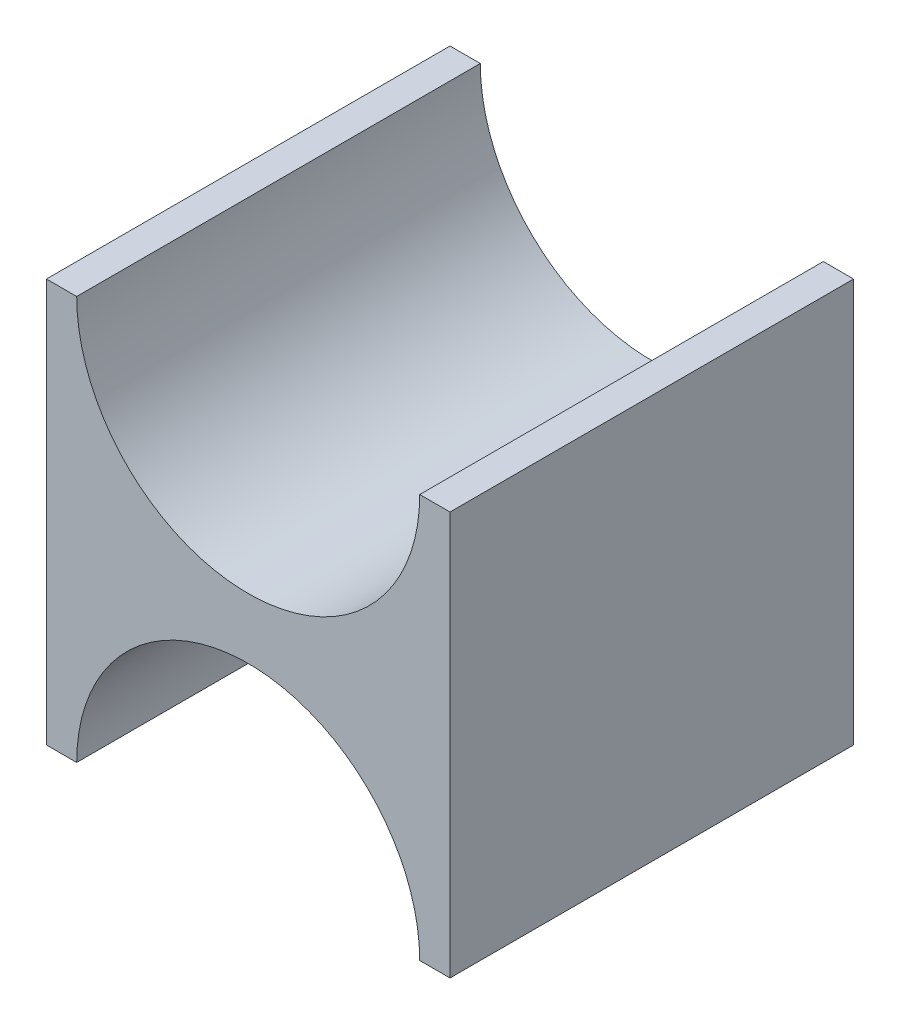
ISO-10303-21;
HEADER;
FILE_DESCRIPTION(('STEP AP214'),'2;1');
FILE_NAME('part.step','',(''),(''),'','','');
FILE_SCHEMA(('AUTOMOTIVE_DESIGN { 1 0 10303 214 1 1 1 1 }'));
ENDSEC;
DATA;
#1=APPLICATION_CONTEXT('core data for automotive mechanical design processes');
#2=APPLICATION_PROTOCOL_DEFINITION('international standard','automotive_design',2000,#1);
#3=PRODUCT_CONTEXT('',#1,'mechanical');
#4=PRODUCT('Part','Part','',(#3));
#5=PRODUCT_RELATED_PRODUCT_CATEGORY('part','',(#4));
#6=PRODUCT_DEFINITION_FORMATION('','',#4);
#7=PRODUCT_DEFINITION_CONTEXT('part definition',#1,'design');
#8=PRODUCT_DEFINITION('design','',#6,#7);
#9=PRODUCT_DEFINITION_SHAPE('','',#8);
#10=(LENGTH_UNIT() NAMED_UNIT(*) SI_UNIT(.MILLI.,.METRE.));
#11=(NAMED_UNIT(*) PLANE_ANGLE_UNIT() SI_UNIT($,.RADIAN.));
#12=(NAMED_UNIT(*) SI_UNIT($,.STERADIAN.) SOLID_ANGLE_UNIT());
#13=UNCERTAINTY_MEASURE_WITH_UNIT(LENGTH_MEASURE(1.E-05),#10,'distance_accuracy_value','');
#14=(GEOMETRIC_REPRESENTATION_CONTEXT(3) GLOBAL_UNCERTAINTY_ASSIGNED_CONTEXT((#13)) GLOBAL_UNIT_ASSIGNED_CONTEXT((#10,
#11,#12)) REPRESENTATION_CONTEXT('',''));
#15=CARTESIAN_POINT('',(0.,0.,0.));
#16=DIRECTION('',(0.,0.,1.));
#17=DIRECTION('',(1.,0.,0.));
#18=AXIS2_PLACEMENT_3D('',#15,#16,#17);
#19=CARTESIAN_POINT('',(-9.99999999999999,10.,20.));
#20=DIRECTION('',(1.,0.,0.));
#21=DIRECTION('',(0.,1.,0.));
#22=AXIS2_PLACEMENT_3D('',#19,#20,#21);
#23=PLANE('',#22);
#24=DIRECTION('',(0.,-1.,0.));
#25=VECTOR('',#24,1.);
#26=CARTESIAN_POINT('',(-9.99999999999999,10.,0.));
#27=LINE('',#26,#25);
#28=CARTESIAN_POINT('',(-9.99999999999999,10.,0.));
#29=VERTEX_POINT('',#28);
#30=CARTESIAN_POINT('',(-9.99999999999999,-9.99999999999999,0.));
#31=VERTEX_POINT('',#30);
#32=EDGE_CURVE('E135',#29,#31,#27,.T.);
#33=ORIENTED_EDGE('',*,*,#32,.T.);
#34=DIRECTION('',(0.,0.,-1.));
#35=VECTOR('',#34,1.);
#36=CARTESIAN_POINT('',(-9.99999999999999,-9.99999999999999,20.));
#37=LINE('',#36,#35);
#38=CARTESIAN_POINT('',(-9.99999999999999,-9.99999999999999,20.));
#39=VERTEX_POINT('',#38);
#40=EDGE_CURVE('E11',#39,#31,#37,.T.);
#41=ORIENTED_EDGE('',*,*,#40,.F.);
#42=DIRECTION('',(0.,-1.,0.));
#43=VECTOR('',#42,1.);
#44=CARTESIAN_POINT('',(-9.99999999999999,10.,20.));
#45=LINE('',#44,#43);
#46=CARTESIAN_POINT('',(-9.99999999999999,10.,20.));
#47=VERTEX_POINT('',#46);
#48=EDGE_CURVE('E149',#47,#39,#45,.T.);
#49=ORIENTED_EDGE('',*,*,#48,.F.);
#50=DIRECTION('',(0.,0.,-1.));
#51=VECTOR('',#50,1.);
#52=CARTESIAN_POINT('',(-9.99999999999999,10.,20.));
#53=LINE('',#52,#51);
#54=EDGE_CURVE('E131',#47,#29,#53,.T.);
#55=ORIENTED_EDGE('',*,*,#54,.T.);
#56=EDGE_LOOP('',(#33,#41,#49,#55));
#57=FACE_BOUND('',#56,.T.);
#58=ADVANCED_FACE('F39',(#57),#23,.F.);
#59=CARTESIAN_POINT('',(-9.99999999999999,-9.99999999999999,20.));
#60=DIRECTION('',(0.,1.,0.));
#61=DIRECTION('',(-1.,0.,0.));
#62=AXIS2_PLACEMENT_3D('',#59,#60,#61);
#63=PLANE('',#62);
#64=DIRECTION('',(1.,0.,0.));
#65=VECTOR('',#64,1.);
#66=CARTESIAN_POINT('',(-9.99999999999999,-9.99999999999999,0.));
#67=LINE('',#66,#65);
#68=CARTESIAN_POINT('',(-8.49999999999999,-10.,0.));
#69=VERTEX_POINT('',#68);
#70=EDGE_CURVE('E138',#31,#69,#67,.T.);
#71=ORIENTED_EDGE('',*,*,#70,.T.);
#72=DIRECTION('',(0.,0.,-1.));
#73=VECTOR('',#72,1.);
#74=CARTESIAN_POINT('',(-8.49999999999999,-10.,20.));
#75=LINE('',#74,#73);
#76=CARTESIAN_POINT('',(-8.49999999999999,-10.,20.));
#77=VERTEX_POINT('',#76);
#78=EDGE_CURVE('E47',#77,#69,#75,.T.);
#79=ORIENTED_EDGE('',*,*,#78,.F.);
#80=DIRECTION('',(1.,0.,0.));
#81=VECTOR('',#80,1.);
#82=CARTESIAN_POINT('',(-9.99999999999999,-9.99999999999999,20.));
#83=LINE('',#82,#81);
#84=EDGE_CURVE('E98',#39,#77,#83,.T.);
#85=ORIENTED_EDGE('',*,*,#84,.F.);
#86=ORIENTED_EDGE('',*,*,#40,.T.);
#87=EDGE_LOOP('',(#71,#79,#85,#86));
#88=FACE_BOUND('',#87,.T.);
#89=ADVANCED_FACE('F184',(#88),#63,.F.);
#90=CARTESIAN_POINT('',(0.,-9.99999999999999,20.));
#91=DIRECTION('',(0.,0.,-1.));
#92=DIRECTION('',(-1.,0.,0.));
#93=AXIS2_PLACEMENT_3D('',#90,#91,#92);
#94=CYLINDRICAL_SURFACE('',#93,8.5);
#95=CARTESIAN_POINT('',(0.,-9.99999999999999,0.));
#96=DIRECTION('',(0.,0.,-1.));
#97=DIRECTION('',(-1.,0.,0.));
#98=AXIS2_PLACEMENT_3D('',#95,#96,#97);
#99=CIRCLE('',#98,8.5);
#100=CARTESIAN_POINT('',(8.50000000000002,-9.99999999999999,0.));
#101=VERTEX_POINT('',#100);
#102=EDGE_CURVE('E140',#69,#101,#99,.T.);
#103=ORIENTED_EDGE('',*,*,#102,.T.);
#104=DIRECTION('',(0.,0.,-1.));
#105=VECTOR('',#104,1.);
#106=CARTESIAN_POINT('',(8.50000000000002,-9.99999999999999,20.));
#107=LINE('',#106,#105);
#108=CARTESIAN_POINT('',(8.50000000000002,-9.99999999999999,20.));
#109=VERTEX_POINT('',#108);
#110=EDGE_CURVE('E156',#109,#101,#107,.T.);
#111=ORIENTED_EDGE('',*,*,#110,.F.);
#112=CARTESIAN_POINT('',(0.,-9.99999999999999,20.));
#113=DIRECTION('',(0.,0.,-1.));
#114=DIRECTION('',(-1.,0.,0.));
#115=AXIS2_PLACEMENT_3D('',#112,#113,#114);
#116=CIRCLE('',#115,8.5);
#117=EDGE_CURVE('E164',#77,#109,#116,.T.);
#118=ORIENTED_EDGE('',*,*,#117,.F.);
#119=ORIENTED_EDGE('',*,*,#78,.T.);
#120=EDGE_LOOP('',(#103,#111,#118,#119));
#121=FACE_BOUND('',#120,.T.);
#122=ADVANCED_FACE('F162',(#121),#94,.F.);
#123=CARTESIAN_POINT('',(10.,-9.99999999999999,20.));
#124=DIRECTION('',(0.,1.,0.));
#125=DIRECTION('',(-1.,0.,0.));
#126=AXIS2_PLACEMENT_3D('',#123,#124,#125);
#127=PLANE('',#126);
#128=DIRECTION('',(1.,0.,0.));
#129=VECTOR('',#128,1.);
#130=CARTESIAN_POINT('',(10.,-9.99999999999999,0.));
#131=LINE('',#130,#129);
#132=CARTESIAN_POINT('',(10.,-9.99999999999999,0.));
#133=VERTEX_POINT('',#132);
#134=EDGE_CURVE('E142',#101,#133,#131,.T.);
#135=ORIENTED_EDGE('',*,*,#134,.T.);
#136=DIRECTION('',(0.,0.,-1.));
#137=VECTOR('',#136,1.);
#138=CARTESIAN_POINT('',(10.,-9.99999999999999,20.));
#139=LINE('',#138,#137);
#140=CARTESIAN_POINT('',(10.,-9.99999999999999,20.));
#141=VERTEX_POINT('',#140);
#142=EDGE_CURVE('E153',#141,#133,#139,.T.);
#143=ORIENTED_EDGE('',*,*,#142,.F.);
#144=DIRECTION('',(1.,0.,0.));
#145=VECTOR('',#144,1.);
#146=CARTESIAN_POINT('',(10.,-9.99999999999999,20.));
#147=LINE('',#146,#145);
#148=EDGE_CURVE('E176',#109,#141,#147,.T.);
#149=ORIENTED_EDGE('',*,*,#148,.F.);
#150=ORIENTED_EDGE('',*,*,#110,.T.);
#151=EDGE_LOOP('',(#135,#143,#149,#150));
#152=FACE_BOUND('',#151,.T.);
#153=ADVANCED_FACE('F172',(#152),#127,.F.);
#154=CARTESIAN_POINT('',(10.,10.,20.));
#155=DIRECTION('',(-1.,0.,0.));
#156=DIRECTION('',(0.,-1.,0.));
#157=AXIS2_PLACEMENT_3D('',#154,#155,#156);
#158=PLANE('',#157);
#159=DIRECTION('',(0.,1.,0.));
#160=VECTOR('',#159,1.);
#161=CARTESIAN_POINT('',(10.,10.,0.));
#162=LINE('',#161,#160);
#163=CARTESIAN_POINT('',(10.,10.,0.));
#164=VERTEX_POINT('',#163);
#165=EDGE_CURVE('E144',#133,#164,#162,.T.);
#166=ORIENTED_EDGE('',*,*,#165,.T.);
#167=DIRECTION('',(0.,0.,-1.));
#168=VECTOR('',#167,1.);
#169=CARTESIAN_POINT('',(10.,10.,20.));
#170=LINE('',#169,#168);
#171=CARTESIAN_POINT('',(10.,10.,20.));
#172=VERTEX_POINT('',#171);
#173=EDGE_CURVE('E126',#172,#164,#170,.T.);
#174=ORIENTED_EDGE('',*,*,#173,.F.);
#175=DIRECTION('',(0.,1.,0.));
#176=VECTOR('',#175,1.);
#177=CARTESIAN_POINT('',(10.,10.,20.));
#178=LINE('',#177,#176);
#179=EDGE_CURVE('E117',#141,#172,#178,.T.);
#180=ORIENTED_EDGE('',*,*,#179,.F.);
#181=ORIENTED_EDGE('',*,*,#142,.T.);
#182=EDGE_LOOP('',(#166,#174,#180,#181));
#183=FACE_BOUND('',#182,.T.);
#184=ADVANCED_FACE('F175',(#183),#158,.F.);
#185=CARTESIAN_POINT('',(8.50000000000002,10.,20.));
#186=DIRECTION('',(0.,-1.,0.));
#187=DIRECTION('',(0.,0.,-1.));
#188=AXIS2_PLACEMENT_3D('',#185,#186,#187);
#189=PLANE('',#188);
#190=DIRECTION('',(-1.,0.,0.));
#191=VECTOR('',#190,1.);
#192=CARTESIAN_POINT('',(8.50000000000002,10.,0.));
#193=LINE('',#192,#191);
#194=CARTESIAN_POINT('',(8.50000000000002,10.,0.));
#195=VERTEX_POINT('',#194);
#196=EDGE_CURVE('E125',#164,#195,#193,.T.);
#197=ORIENTED_EDGE('',*,*,#196,.T.);
#198=DIRECTION('',(0.,0.,-1.));
#199=VECTOR('',#198,1.);
#200=CARTESIAN_POINT('',(8.50000000000002,10.,20.));
#201=LINE('',#200,#199);
#202=CARTESIAN_POINT('',(8.50000000000002,10.,20.));
#203=VERTEX_POINT('',#202);
#204=EDGE_CURVE('E122',#203,#195,#201,.T.);
#205=ORIENTED_EDGE('',*,*,#204,.F.);
#206=DIRECTION('',(-1.,0.,0.));
#207=VECTOR('',#206,1.);
#208=CARTESIAN_POINT('',(8.50000000000002,10.,20.));
#209=LINE('',#208,#207);
#210=EDGE_CURVE('E111',#172,#203,#209,.T.);
#211=ORIENTED_EDGE('',*,*,#210,.F.);
#212=ORIENTED_EDGE('',*,*,#173,.T.);
#213=EDGE_LOOP('',(#197,#205,#211,#212));
#214=FACE_BOUND('',#213,.T.);
#215=ADVANCED_FACE('F123',(#214),#189,.F.);
#216=CARTESIAN_POINT('',(0.,10.,20.));
#217=DIRECTION('',(0.,0.,-1.));
#218=DIRECTION('',(-1.,0.,0.));
#219=AXIS2_PLACEMENT_3D('',#216,#217,#218);
#220=CYLINDRICAL_SURFACE('',#219,8.5);
#221=CARTESIAN_POINT('',(0.,10.,0.));
#222=DIRECTION('',(0.,0.,-1.));
#223=DIRECTION('',(-1.,0.,0.));
#224=AXIS2_PLACEMENT_3D('',#221,#222,#223);
#225=CIRCLE('',#224,8.5);
#226=CARTESIAN_POINT('',(-8.49999999999999,10.,0.));
#227=VERTEX_POINT('',#226);
#228=EDGE_CURVE('E84',#195,#227,#225,.T.);
#229=ORIENTED_EDGE('',*,*,#228,.T.);
#230=DIRECTION('',(0.,0.,-1.));
#231=VECTOR('',#230,1.);
#232=CARTESIAN_POINT('',(-8.49999999999999,10.,20.));
#233=LINE('',#232,#231);
#234=CARTESIAN_POINT('',(-8.49999999999999,10.,20.));
#235=VERTEX_POINT('',#234);
#236=EDGE_CURVE('E127',#235,#227,#233,.T.);
#237=ORIENTED_EDGE('',*,*,#236,.F.);
#238=CARTESIAN_POINT('',(0.,10.,20.));
#239=DIRECTION('',(0.,0.,-1.));
#240=DIRECTION('',(-1.,0.,0.));
#241=AXIS2_PLACEMENT_3D('',#238,#239,#240);
#242=CIRCLE('',#241,8.5);
#243=EDGE_CURVE('E115',#203,#235,#242,.T.);
#244=ORIENTED_EDGE('',*,*,#243,.F.);
#245=ORIENTED_EDGE('',*,*,#204,.T.);
#246=EDGE_LOOP('',(#229,#237,#244,#245));
#247=FACE_BOUND('',#246,.T.);
#248=ADVANCED_FACE('F129',(#247),#220,.F.);
#249=CARTESIAN_POINT('',(-8.49999999999999,10.,20.));
#250=DIRECTION('',(0.,-1.,0.));
#251=DIRECTION('',(0.,0.,-1.));
#252=AXIS2_PLACEMENT_3D('',#249,#250,#251);
#253=PLANE('',#252);
#254=DIRECTION('',(-1.,0.,0.));
#255=VECTOR('',#254,1.);
#256=CARTESIAN_POINT('',(-8.49999999999999,10.,0.));
#257=LINE('',#256,#255);
#258=EDGE_CURVE('E90',#227,#29,#257,.T.);
#259=ORIENTED_EDGE('',*,*,#258,.T.);
#260=ORIENTED_EDGE('',*,*,#54,.F.);
#261=DIRECTION('',(-1.,0.,0.));
#262=VECTOR('',#261,1.);
#263=CARTESIAN_POINT('',(-8.49999999999999,10.,20.));
#264=LINE('',#263,#262);
#265=EDGE_CURVE('E55',#235,#47,#264,.T.);
#266=ORIENTED_EDGE('',*,*,#265,.F.);
#267=ORIENTED_EDGE('',*,*,#236,.T.);
#268=EDGE_LOOP('',(#259,#260,#266,#267));
#269=FACE_BOUND('',#268,.T.);
#270=ADVANCED_FACE('F200',(#269),#253,.F.);
#271=CARTESIAN_POINT('',(0.,-9.99999999999999,20.));
#272=DIRECTION('',(0.,0.,-1.));
#273=DIRECTION('',(-1.,0.,0.));
#274=AXIS2_PLACEMENT_3D('',#271,#272,#273);
#275=PLANE('',#274);
#276=ORIENTED_EDGE('',*,*,#48,.T.);
#277=ORIENTED_EDGE('',*,*,#84,.T.);
#278=ORIENTED_EDGE('',*,*,#117,.T.);
#279=ORIENTED_EDGE('',*,*,#148,.T.);
#280=ORIENTED_EDGE('',*,*,#179,.T.);
#281=ORIENTED_EDGE('',*,*,#210,.T.);
#282=ORIENTED_EDGE('',*,*,#243,.T.);
#283=ORIENTED_EDGE('',*,*,#265,.T.);
#284=EDGE_LOOP('',(#276,#277,#278,#279,#280,#281,#282,#283));
#285=FACE_BOUND('',#284,.T.);
#286=ADVANCED_FACE('F113',(#285),#275,.F.);
#287=CARTESIAN_POINT('',(0.,-9.99999999999999,0.));
#288=DIRECTION('',(0.,0.,-1.));
#289=DIRECTION('',(-1.,0.,0.));
#290=AXIS2_PLACEMENT_3D('',#287,#288,#289);
#291=PLANE('',#290);
#292=ORIENTED_EDGE('',*,*,#32,.F.);
#293=ORIENTED_EDGE('',*,*,#258,.F.);
#294=ORIENTED_EDGE('',*,*,#228,.F.);
#295=ORIENTED_EDGE('',*,*,#196,.F.);
#296=ORIENTED_EDGE('',*,*,#165,.F.);
#297=ORIENTED_EDGE('',*,*,#134,.F.);
#298=ORIENTED_EDGE('',*,*,#102,.F.);
#299=ORIENTED_EDGE('',*,*,#70,.F.);
#300=EDGE_LOOP('',(#292,#293,#294,#295,#296,#297,#298,#299));
#301=FACE_BOUND('',#300,.T.);
#302=ADVANCED_FACE('F168',(#301),#291,.T.);
#303=CLOSED_SHELL('',(#58,#89,#122,#153,#184,#215,#248,#270,#286,#302));
#304=MANIFOLD_SOLID_BREP('B2',#303);
#305=ADVANCED_BREP_SHAPE_REPRESENTATION('',(#18,#304),#14);
#306=SHAPE_DEFINITION_REPRESENTATION(#9,#305);
ENDSEC;
END-ISO-10303-21;
